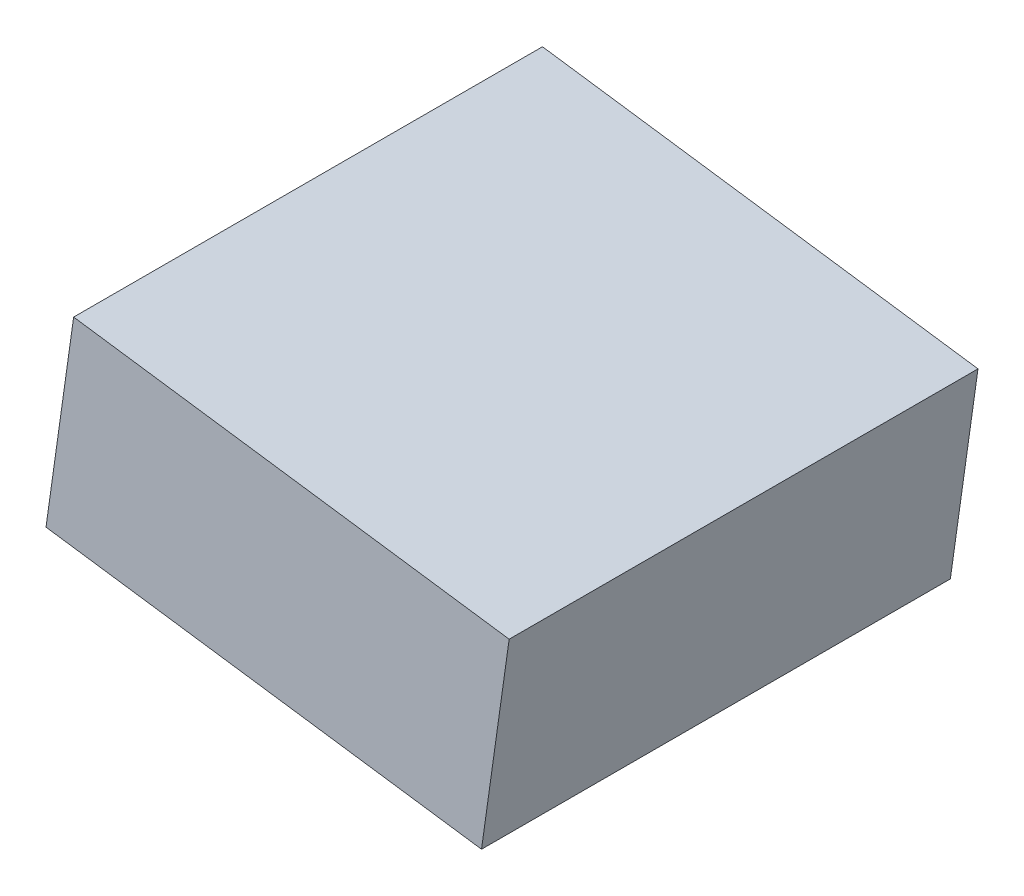
ISO-10303-21;
HEADER;
FILE_DESCRIPTION(('STEP AP214'),'2;1');
FILE_NAME('part.step','',(''),(''),'','','');
FILE_SCHEMA(('AUTOMOTIVE_DESIGN { 1 0 10303 214 1 1 1 1 }'));
ENDSEC;
DATA;
#1=APPLICATION_CONTEXT('core data for automotive mechanical design processes');
#2=APPLICATION_PROTOCOL_DEFINITION('international standard','automotive_design',2000,#1);
#3=PRODUCT_CONTEXT('',#1,'mechanical');
#4=PRODUCT('Part','Part','',(#3));
#5=PRODUCT_RELATED_PRODUCT_CATEGORY('part','',(#4));
#6=PRODUCT_DEFINITION_FORMATION('','',#4);
#7=PRODUCT_DEFINITION_CONTEXT('part definition',#1,'design');
#8=PRODUCT_DEFINITION('design','',#6,#7);
#9=PRODUCT_DEFINITION_SHAPE('','',#8);
#10=(LENGTH_UNIT() NAMED_UNIT(*) SI_UNIT(.MILLI.,.METRE.));
#11=(NAMED_UNIT(*) PLANE_ANGLE_UNIT() SI_UNIT($,.RADIAN.));
#12=(NAMED_UNIT(*) SI_UNIT($,.STERADIAN.) SOLID_ANGLE_UNIT());
#13=UNCERTAINTY_MEASURE_WITH_UNIT(LENGTH_MEASURE(1.E-05),#10,'distance_accuracy_value','');
#14=(GEOMETRIC_REPRESENTATION_CONTEXT(3) GLOBAL_UNCERTAINTY_ASSIGNED_CONTEXT((#13)) GLOBAL_UNIT_ASSIGNED_CONTEXT((#10,
#11,#12)) REPRESENTATION_CONTEXT('',''));
#15=CARTESIAN_POINT('',(0.,0.,0.));
#16=DIRECTION('',(0.,0.,1.));
#17=DIRECTION('',(1.,0.,0.));
#18=AXIS2_PLACEMENT_3D('',#15,#16,#17);
#19=CARTESIAN_POINT('',(826.634548566082,620.304296625978,2665.41988044485));
#20=DIRECTION('',(0.990268068741567,-0.139173100960088,0.));
#21=DIRECTION('',(-0.000106014336860083,-0.000754331202663286,-0.999999709872657));
#22=AXIS2_PLACEMENT_3D('',#19,#20,#21);
#23=PLANE('',#22);
#24=CARTESIAN_POINT('',(825.242817960261,610.401618811601,2665.42749788932));
#25=CARTESIAN_POINT('',(825.244076247751,610.410571992315,2677.29652582368));
#26=CARTESIAN_POINT('',(825.245334535242,610.419525173028,2689.16555375806));
#27=B_SPLINE_CURVE_WITH_KNOTS('',2,(#24,#25,#26),.UNSPECIFIED.,.F.,.F.,(3,3),(0.,1.),.UNSPECIFIED.);
#28=CARTESIAN_POINT('',(825.242817960261,610.401618811601,2665.42749788932));
#29=VERTEX_POINT('',#28);
#30=CARTESIAN_POINT('',(825.245334535242,610.419525173028,2689.16555375806));
#31=VERTEX_POINT('',#30);
#32=EDGE_CURVE('E89',#29,#31,#27,.T.);
#33=ORIENTED_EDGE('',*,*,#32,.F.);
#34=DIRECTION('',(-0.139173060582166,-0.990267781437723,0.000761744447259926));
#35=VECTOR('',#34,1.);
#36=CARTESIAN_POINT('',(826.634548566082,620.304296625978,2665.41988044485));
#37=LINE('',#36,#35);
#38=CARTESIAN_POINT('',(826.634548566082,620.304296625978,2665.41988044485));
#39=VERTEX_POINT('',#38);
#40=EDGE_CURVE('E33',#39,#29,#37,.T.);
#41=ORIENTED_EDGE('',*,*,#40,.F.);
#42=CARTESIAN_POINT('',(826.634548566082,620.304296625978,2665.41988044485));
#43=CARTESIAN_POINT('',(826.635806853573,620.313249806692,2677.28890837922));
#44=CARTESIAN_POINT('',(826.637065141064,620.322202987406,2689.15793631359));
#45=B_SPLINE_CURVE_WITH_KNOTS('',2,(#42,#43,#44),.UNSPECIFIED.,.F.,.F.,(3,3),(0.,1.),.UNSPECIFIED.);
#46=CARTESIAN_POINT('',(826.637065141064,620.322202987406,2689.15793631359));
#47=VERTEX_POINT('',#46);
#48=EDGE_CURVE('E72',#39,#47,#45,.T.);
#49=ORIENTED_EDGE('',*,*,#48,.T.);
#50=DIRECTION('',(-0.139173060582166,-0.990267781437723,0.000761744447259926));
#51=VECTOR('',#50,1.);
#52=CARTESIAN_POINT('',(826.637065141064,620.322202987406,2689.15793631359));
#53=LINE('',#52,#51);
#54=EDGE_CURVE('E11',#47,#31,#53,.T.);
#55=ORIENTED_EDGE('',*,*,#54,.T.);
#56=EDGE_LOOP('',(#33,#41,#49,#55));
#57=FACE_BOUND('',#56,.T.);
#58=ADVANCED_FACE('F17',(#57),#23,.T.);
#59=CARTESIAN_POINT('',(826.637065141064,620.322202987406,2689.15793631359));
#60=DIRECTION('',(0.000106014336863525,0.000754331202662807,0.999999709872657));
#61=DIRECTION('',(0.990268068741567,-0.139173100960088,0.));
#62=AXIS2_PLACEMENT_3D('',#59,#60,#61);
#63=PLANE('',#62);
#64=CARTESIAN_POINT('',(825.245334535242,610.419525173028,2689.16555375806));
#65=CARTESIAN_POINT('',(814.221340754981,611.968846460661,2689.16555375806));
#66=CARTESIAN_POINT('',(803.19734697472,613.518167748293,2689.16555375806));
#67=B_SPLINE_CURVE_WITH_KNOTS('',2,(#64,#65,#66),.UNSPECIFIED.,.F.,.F.,(3,3),(1.,2.),.UNSPECIFIED.);
#68=CARTESIAN_POINT('',(803.19734697472,613.518167748293,2689.16555375806));
#69=VERTEX_POINT('',#68);
#70=EDGE_CURVE('E97',#31,#69,#67,.T.);
#71=ORIENTED_EDGE('',*,*,#70,.F.);
#72=ORIENTED_EDGE('',*,*,#54,.F.);
#73=CARTESIAN_POINT('',(826.637065141064,620.322202987406,2689.15793631359));
#74=CARTESIAN_POINT('',(815.613071360803,621.871524275038,2689.15793631359));
#75=CARTESIAN_POINT('',(804.589077580542,623.42084556267,2689.15793631359));
#76=B_SPLINE_CURVE_WITH_KNOTS('',2,(#73,#74,#75),.UNSPECIFIED.,.F.,.F.,(3,3),(1.,2.),.UNSPECIFIED.);
#77=CARTESIAN_POINT('',(804.589077580542,623.42084556267,2689.15793631359));
#78=VERTEX_POINT('',#77);
#79=EDGE_CURVE('E68',#47,#78,#76,.T.);
#80=ORIENTED_EDGE('',*,*,#79,.T.);
#81=DIRECTION('',(-0.139173060582166,-0.990267781437723,0.000761744447259926));
#82=VECTOR('',#81,1.);
#83=CARTESIAN_POINT('',(804.589077580542,623.42084556267,2689.15793631359));
#84=LINE('',#83,#82);
#85=EDGE_CURVE('E25',#78,#69,#84,.T.);
#86=ORIENTED_EDGE('',*,*,#85,.T.);
#87=EDGE_LOOP('',(#71,#72,#80,#86));
#88=FACE_BOUND('',#87,.T.);
#89=ADVANCED_FACE('F69',(#88),#63,.T.);
#90=CARTESIAN_POINT('',(804.589077580542,623.42084556267,2689.15793631359));
#91=DIRECTION('',(-0.990268068741567,0.139173100960088,0.));
#92=DIRECTION('',(0.000106014336851201,0.000754331202664528,0.999999709872657));
#93=AXIS2_PLACEMENT_3D('',#90,#91,#92);
#94=PLANE('',#93);
#95=CARTESIAN_POINT('',(803.19734697472,613.518167748293,2689.16555375806));
#96=CARTESIAN_POINT('',(803.19608868723,613.509214567579,2677.29652582368));
#97=CARTESIAN_POINT('',(803.194830399739,613.500261386865,2665.42749788932));
#98=B_SPLINE_CURVE_WITH_KNOTS('',2,(#95,#96,#97),.UNSPECIFIED.,.F.,.F.,(3,3),(2.,3.),.UNSPECIFIED.);
#99=CARTESIAN_POINT('',(803.194830399739,613.500261386865,2665.42749788932));
#100=VERTEX_POINT('',#99);
#101=EDGE_CURVE('E66',#69,#100,#98,.T.);
#102=ORIENTED_EDGE('',*,*,#101,.F.);
#103=ORIENTED_EDGE('',*,*,#85,.F.);
#104=CARTESIAN_POINT('',(804.589077580542,623.42084556267,2689.15793631359));
#105=CARTESIAN_POINT('',(804.587819293052,623.411892381956,2677.28890837922));
#106=CARTESIAN_POINT('',(804.586561005561,623.402939201242,2665.41988044485));
#107=B_SPLINE_CURVE_WITH_KNOTS('',2,(#104,#105,#106),.UNSPECIFIED.,.F.,.F.,(3,3),(2.,3.),.UNSPECIFIED.);
#108=CARTESIAN_POINT('',(804.586561005561,623.402939201242,2665.41988044485));
#109=VERTEX_POINT('',#108);
#110=EDGE_CURVE('E63',#78,#109,#107,.T.);
#111=ORIENTED_EDGE('',*,*,#110,.T.);
#112=DIRECTION('',(-0.139173060582166,-0.990267781437723,0.000761744447259926));
#113=VECTOR('',#112,1.);
#114=CARTESIAN_POINT('',(804.586561005561,623.402939201242,2665.41988044485));
#115=LINE('',#114,#113);
#116=EDGE_CURVE('E49',#109,#100,#115,.T.);
#117=ORIENTED_EDGE('',*,*,#116,.T.);
#118=EDGE_LOOP('',(#102,#103,#111,#117));
#119=FACE_BOUND('',#118,.T.);
#120=ADVANCED_FACE('F61',(#119),#94,.T.);
#121=CARTESIAN_POINT('',(804.586561005561,623.402939201242,2665.41988044485));
#122=DIRECTION('',(-0.000106014336866245,-0.000754331202662419,-0.999999709872657));
#123=DIRECTION('',(-0.990268068741567,0.139173100960088,0.));
#124=AXIS2_PLACEMENT_3D('',#121,#122,#123);
#125=PLANE('',#124);
#126=CARTESIAN_POINT('',(803.194830399739,613.500261386865,2665.42749788932));
#127=CARTESIAN_POINT('',(814.21882418,611.950940099233,2665.42749788932));
#128=CARTESIAN_POINT('',(825.242817960261,610.401618811601,2665.42749788932));
#129=B_SPLINE_CURVE_WITH_KNOTS('',2,(#126,#127,#128),.UNSPECIFIED.,.F.,.F.,(3,3),(3.,4.),.UNSPECIFIED.);
#130=EDGE_CURVE('E110',#100,#29,#129,.T.);
#131=ORIENTED_EDGE('',*,*,#130,.F.);
#132=ORIENTED_EDGE('',*,*,#116,.F.);
#133=CARTESIAN_POINT('',(804.586561005561,623.402939201242,2665.41988044485));
#134=CARTESIAN_POINT('',(815.610554785822,621.85361791361,2665.41988044485));
#135=CARTESIAN_POINT('',(826.634548566082,620.304296625978,2665.41988044485));
#136=B_SPLINE_CURVE_WITH_KNOTS('',2,(#133,#134,#135),.UNSPECIFIED.,.F.,.F.,(3,3),(3.,4.),.UNSPECIFIED.);
#137=EDGE_CURVE('E75',#109,#39,#136,.T.);
#138=ORIENTED_EDGE('',*,*,#137,.T.);
#139=ORIENTED_EDGE('',*,*,#40,.T.);
#140=EDGE_LOOP('',(#131,#132,#138,#139));
#141=FACE_BOUND('',#140,.T.);
#142=ADVANCED_FACE('F134',(#141),#125,.T.);
#143=CARTESIAN_POINT('',(826.635806853573,620.313249806692,2677.28890837922));
#144=DIRECTION('',(0.139173060582166,0.990267781437723,-0.000761744447259926));
#145=DIRECTION('',(-0.947941965636704,0.133001987377289,-0.289338039563609));
#146=AXIS2_PLACEMENT_3D('',#143,#144,#145);
#147=PLANE('',#146);
#148=ORIENTED_EDGE('',*,*,#48,.F.);
#149=ORIENTED_EDGE('',*,*,#137,.F.);
#150=ORIENTED_EDGE('',*,*,#110,.F.);
#151=ORIENTED_EDGE('',*,*,#79,.F.);
#152=EDGE_LOOP('',(#148,#149,#150,#151));
#153=FACE_BOUND('',#152,.T.);
#154=ADVANCED_FACE('F74',(#153),#147,.T.);
#155=CARTESIAN_POINT('',(825.244076247751,610.410571992315,2677.29652582368));
#156=DIRECTION('',(0.139173060582166,0.990267781437723,-0.000761744447259926));
#157=DIRECTION('',(-0.947941965636704,0.133001987377289,-0.289338039563609));
#158=AXIS2_PLACEMENT_3D('',#155,#156,#157);
#159=PLANE('',#158);
#160=ORIENTED_EDGE('',*,*,#32,.T.);
#161=ORIENTED_EDGE('',*,*,#70,.T.);
#162=ORIENTED_EDGE('',*,*,#101,.T.);
#163=ORIENTED_EDGE('',*,*,#130,.T.);
#164=EDGE_LOOP('',(#160,#161,#162,#163));
#165=FACE_BOUND('',#164,.T.);
#166=ADVANCED_FACE('F127',(#165),#159,.F.);
#167=CLOSED_SHELL('',(#58,#89,#120,#142,#154,#166));
#168=MANIFOLD_SOLID_BREP('B1',#167);
#169=ADVANCED_BREP_SHAPE_REPRESENTATION('',(#18,#168),#14);
#170=SHAPE_DEFINITION_REPRESENTATION(#9,#169);
ENDSEC;
END-ISO-10303-21;
